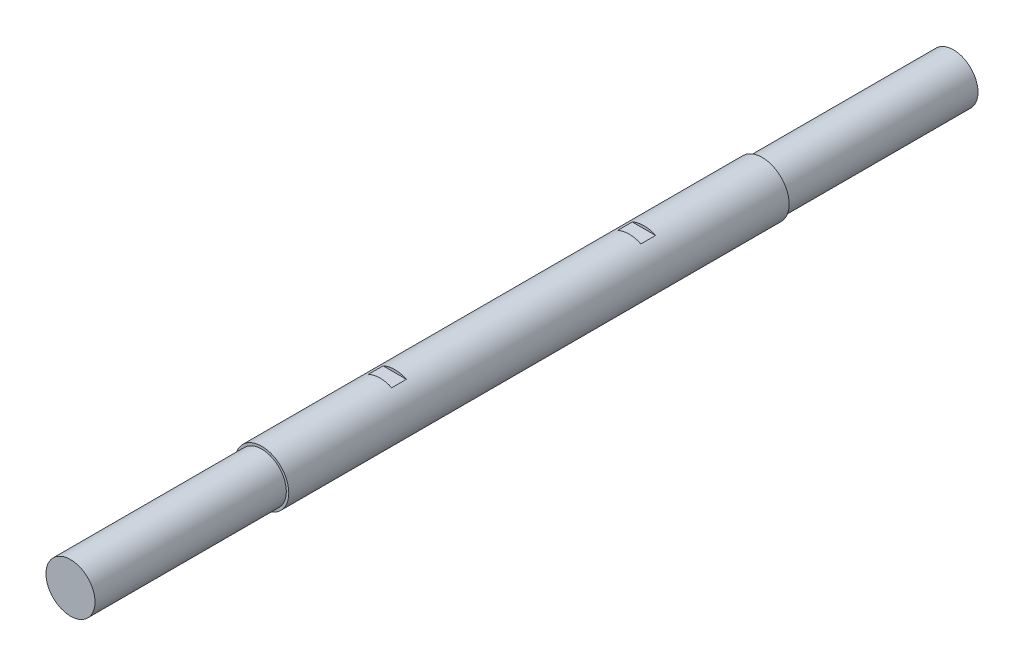
ISO-10303-21;
HEADER;
FILE_DESCRIPTION(('STEP AP214'),'2;1');
FILE_NAME('part.step','',(''),(''),'','','');
FILE_SCHEMA(('AUTOMOTIVE_DESIGN { 1 0 10303 214 1 1 1 1 }'));
ENDSEC;
DATA;
#1=APPLICATION_CONTEXT('core data for automotive mechanical design processes');
#2=APPLICATION_PROTOCOL_DEFINITION('international standard','automotive_design',2000,#1);
#3=PRODUCT_CONTEXT('',#1,'mechanical');
#4=PRODUCT('Part','Part','',(#3));
#5=PRODUCT_RELATED_PRODUCT_CATEGORY('part','',(#4));
#6=PRODUCT_DEFINITION_FORMATION('','',#4);
#7=PRODUCT_DEFINITION_CONTEXT('part definition',#1,'design');
#8=PRODUCT_DEFINITION('design','',#6,#7);
#9=PRODUCT_DEFINITION_SHAPE('','',#8);
#10=(LENGTH_UNIT() NAMED_UNIT(*) SI_UNIT(.MILLI.,.METRE.));
#11=(NAMED_UNIT(*) PLANE_ANGLE_UNIT() SI_UNIT($,.RADIAN.));
#12=(NAMED_UNIT(*) SI_UNIT($,.STERADIAN.) SOLID_ANGLE_UNIT());
#13=UNCERTAINTY_MEASURE_WITH_UNIT(LENGTH_MEASURE(1.E-05),#10,'distance_accuracy_value','');
#14=(GEOMETRIC_REPRESENTATION_CONTEXT(3) GLOBAL_UNCERTAINTY_ASSIGNED_CONTEXT((#13)) GLOBAL_UNIT_ASSIGNED_CONTEXT((#10,
#11,#12)) REPRESENTATION_CONTEXT('',''));
#15=CARTESIAN_POINT('',(0.,0.,0.));
#16=DIRECTION('',(0.,0.,1.));
#17=DIRECTION('',(1.,0.,0.));
#18=AXIS2_PLACEMENT_3D('',#15,#16,#17);
#19=CARTESIAN_POINT('',(0.,0.,-180.));
#20=DIRECTION('',(0.,0.,-1.));
#21=DIRECTION('',(-1.,0.,0.));
#22=AXIS2_PLACEMENT_3D('',#19,#20,#21);
#23=CYLINDRICAL_SURFACE('',#22,11.);
#24=DIRECTION('',(0.,0.,-1.));
#25=VECTOR('',#24,1.);
#26=CARTESIAN_POINT('',(-4.7532725568812,9.91999999999996,-180.));
#27=LINE('',#26,#25);
#28=CARTESIAN_POINT('',(-4.7532725568812,9.91999999999996,-47.8));
#29=VERTEX_POINT('',#28);
#30=CARTESIAN_POINT('',(-4.7532725568812,9.91999999999996,-53.8));
#31=VERTEX_POINT('',#30);
#32=EDGE_CURVE('E78',#29,#31,#27,.T.);
#33=ORIENTED_EDGE('',*,*,#32,.T.);
#34=CARTESIAN_POINT('',(0.,0.,-53.8));
#35=DIRECTION('',(0.,0.,1.));
#36=DIRECTION('',(1.,0.,0.));
#37=AXIS2_PLACEMENT_3D('',#34,#35,#36);
#38=CIRCLE('',#37,11.);
#39=CARTESIAN_POINT('',(4.7532725568812,9.91999999999996,-53.8));
#40=VERTEX_POINT('',#39);
#41=EDGE_CURVE('E11',#31,#40,#38,.F.);
#42=ORIENTED_EDGE('',*,*,#41,.T.);
#43=DIRECTION('',(0.,0.,-1.));
#44=VECTOR('',#43,1.);
#45=CARTESIAN_POINT('',(4.7532725568812,9.91999999999996,-180.));
#46=LINE('',#45,#44);
#47=CARTESIAN_POINT('',(4.7532725568812,9.91999999999996,-47.8));
#48=VERTEX_POINT('',#47);
#49=EDGE_CURVE('E42',#40,#48,#46,.F.);
#50=ORIENTED_EDGE('',*,*,#49,.T.);
#51=CARTESIAN_POINT('',(0.,0.,-47.8));
#52=DIRECTION('',(0.,0.,-1.));
#53=DIRECTION('',(0.,1.,0.));
#54=AXIS2_PLACEMENT_3D('',#51,#52,#53);
#55=CIRCLE('',#54,11.);
#56=EDGE_CURVE('E73',#48,#29,#55,.F.);
#57=ORIENTED_EDGE('',*,*,#56,.T.);
#58=EDGE_LOOP('',(#33,#42,#50,#57));
#59=FACE_BOUND('',#58,.T.);
#60=CARTESIAN_POINT('',(0.,0.,102.));
#61=DIRECTION('',(0.,0.,1.));
#62=DIRECTION('',(1.,0.,0.));
#63=AXIS2_PLACEMENT_3D('',#60,#61,#62);
#64=CIRCLE('',#63,11.);
#65=CARTESIAN_POINT('',(11.,0.,102.));
#66=VERTEX_POINT('',#65);
#67=EDGE_CURVE('E108',#66,#66,#64,.T.);
#68=ORIENTED_EDGE('',*,*,#67,.F.);
#69=EDGE_LOOP('',(#68));
#70=FACE_BOUND('',#69,.T.);
#71=DIRECTION('',(0.,0.,-1.));
#72=VECTOR('',#71,1.);
#73=CARTESIAN_POINT('',(-4.7532725568812,9.91999999999996,-180.));
#74=LINE('',#73,#72);
#75=CARTESIAN_POINT('',(-4.7532725568812,9.91999999999996,47.8));
#76=VERTEX_POINT('',#75);
#77=CARTESIAN_POINT('',(-4.7532725568812,9.91999999999996,53.8));
#78=VERTEX_POINT('',#77);
#79=EDGE_CURVE('E79',#76,#78,#74,.F.);
#80=ORIENTED_EDGE('',*,*,#79,.F.);
#81=CARTESIAN_POINT('',(0.,0.,47.8));
#82=DIRECTION('',(0.,0.,-1.));
#83=DIRECTION('',(0.,1.,0.));
#84=AXIS2_PLACEMENT_3D('',#81,#82,#83);
#85=CIRCLE('',#84,11.);
#86=CARTESIAN_POINT('',(4.7532725568812,9.91999999999996,47.8));
#87=VERTEX_POINT('',#86);
#88=EDGE_CURVE('E94',#87,#76,#85,.F.);
#89=ORIENTED_EDGE('',*,*,#88,.F.);
#90=DIRECTION('',(0.,0.,-1.));
#91=VECTOR('',#90,1.);
#92=CARTESIAN_POINT('',(4.7532725568812,9.91999999999996,-180.));
#93=LINE('',#92,#91);
#94=CARTESIAN_POINT('',(4.7532725568812,9.91999999999996,53.8));
#95=VERTEX_POINT('',#94);
#96=EDGE_CURVE('E96',#95,#87,#93,.T.);
#97=ORIENTED_EDGE('',*,*,#96,.F.);
#98=CARTESIAN_POINT('',(0.,0.,53.8));
#99=DIRECTION('',(0.,0.,1.));
#100=DIRECTION('',(1.,0.,0.));
#101=AXIS2_PLACEMENT_3D('',#98,#99,#100);
#102=CIRCLE('',#101,11.);
#103=EDGE_CURVE('E92',#78,#95,#102,.F.);
#104=ORIENTED_EDGE('',*,*,#103,.F.);
#105=EDGE_LOOP('',(#80,#89,#97,#104));
#106=FACE_BOUND('',#105,.T.);
#107=CARTESIAN_POINT('',(0.,0.,-102.));
#108=DIRECTION('',(0.,0.,1.));
#109=DIRECTION('',(1.,0.,0.));
#110=AXIS2_PLACEMENT_3D('',#107,#108,#109);
#111=CIRCLE('',#110,11.);
#112=CARTESIAN_POINT('',(11.,0.,-102.));
#113=VERTEX_POINT('',#112);
#114=EDGE_CURVE('E117',#113,#113,#111,.T.);
#115=ORIENTED_EDGE('',*,*,#114,.T.);
#116=EDGE_LOOP('',(#115));
#117=FACE_BOUND('',#116,.T.);
#118=ADVANCED_FACE('F34',(#59,#70,#106,#117),#23,.T.);
#119=CARTESIAN_POINT('',(-11.,19.92,53.8));
#120=DIRECTION('',(0.,0.,1.));
#121=DIRECTION('',(1.,0.,0.));
#122=AXIS2_PLACEMENT_3D('',#119,#120,#121);
#123=PLANE('',#122);
#124=ORIENTED_EDGE('',*,*,#103,.T.);
#125=DIRECTION('',(1.,0.,0.));
#126=VECTOR('',#125,1.);
#127=CARTESIAN_POINT('',(-11.,9.91999999999996,53.8));
#128=LINE('',#127,#126);
#129=EDGE_CURVE('E56',#78,#95,#128,.T.);
#130=ORIENTED_EDGE('',*,*,#129,.F.);
#131=EDGE_LOOP('',(#124,#130));
#132=FACE_BOUND('',#131,.T.);
#133=ADVANCED_FACE('F138',(#132),#123,.F.);
#134=CARTESIAN_POINT('',(-11.,19.92,47.8));
#135=DIRECTION('',(0.,0.,-1.));
#136=DIRECTION('',(0.,1.,0.));
#137=AXIS2_PLACEMENT_3D('',#134,#135,#136);
#138=PLANE('',#137);
#139=ORIENTED_EDGE('',*,*,#88,.T.);
#140=DIRECTION('',(1.,0.,0.));
#141=VECTOR('',#140,1.);
#142=CARTESIAN_POINT('',(-11.,9.91999999999996,47.8));
#143=LINE('',#142,#141);
#144=EDGE_CURVE('E98',#76,#87,#143,.T.);
#145=ORIENTED_EDGE('',*,*,#144,.T.);
#146=EDGE_LOOP('',(#139,#145));
#147=FACE_BOUND('',#146,.T.);
#148=ADVANCED_FACE('F142',(#147),#138,.F.);
#149=CARTESIAN_POINT('',(-11.,9.91999999999996,53.8));
#150=DIRECTION('',(0.,-1.,0.));
#151=DIRECTION('',(0.,0.,-1.));
#152=AXIS2_PLACEMENT_3D('',#149,#150,#151);
#153=PLANE('',#152);
#154=ORIENTED_EDGE('',*,*,#79,.T.);
#155=ORIENTED_EDGE('',*,*,#129,.T.);
#156=ORIENTED_EDGE('',*,*,#96,.T.);
#157=ORIENTED_EDGE('',*,*,#144,.F.);
#158=EDGE_LOOP('',(#154,#155,#156,#157));
#159=FACE_BOUND('',#158,.T.);
#160=ADVANCED_FACE('F152',(#159),#153,.F.);
#161=CARTESIAN_POINT('',(0.,0.,180.));
#162=DIRECTION('',(0.,0.,1.));
#163=DIRECTION('',(1.,0.,0.));
#164=AXIS2_PLACEMENT_3D('',#161,#162,#163);
#165=CYLINDRICAL_SURFACE('',#164,10.);
#166=CARTESIAN_POINT('',(0.,0.,102.));
#167=DIRECTION('',(0.,0.,1.));
#168=DIRECTION('',(1.,0.,0.));
#169=AXIS2_PLACEMENT_3D('',#166,#167,#168);
#170=CIRCLE('',#169,10.);
#171=CARTESIAN_POINT('',(10.,0.,102.));
#172=VERTEX_POINT('',#171);
#173=EDGE_CURVE('E105',#172,#172,#170,.T.);
#174=ORIENTED_EDGE('',*,*,#173,.T.);
#175=EDGE_LOOP('',(#174));
#176=FACE_BOUND('',#175,.T.);
#177=CARTESIAN_POINT('',(0.,0.,180.));
#178=DIRECTION('',(0.,0.,1.));
#179=DIRECTION('',(1.,0.,0.));
#180=AXIS2_PLACEMENT_3D('',#177,#178,#179);
#181=CIRCLE('',#180,10.);
#182=CARTESIAN_POINT('',(10.,0.,180.));
#183=VERTEX_POINT('',#182);
#184=EDGE_CURVE('E100',#183,#183,#181,.T.);
#185=ORIENTED_EDGE('',*,*,#184,.F.);
#186=EDGE_LOOP('',(#185));
#187=FACE_BOUND('',#186,.T.);
#188=ADVANCED_FACE('F155',(#176,#187),#165,.T.);
#189=CARTESIAN_POINT('',(0.,11.,102.));
#190=DIRECTION('',(0.,0.,1.));
#191=DIRECTION('',(1.,0.,0.));
#192=AXIS2_PLACEMENT_3D('',#189,#190,#191);
#193=PLANE('',#192);
#194=ORIENTED_EDGE('',*,*,#67,.T.);
#195=EDGE_LOOP('',(#194));
#196=FACE_BOUND('',#195,.T.);
#197=ORIENTED_EDGE('',*,*,#173,.F.);
#198=EDGE_LOOP('',(#197));
#199=FACE_BOUND('',#198,.T.);
#200=ADVANCED_FACE('F149',(#196,#199),#193,.T.);
#201=CARTESIAN_POINT('',(0.,0.,180.));
#202=DIRECTION('',(0.,0.,1.));
#203=DIRECTION('',(1.,0.,0.));
#204=AXIS2_PLACEMENT_3D('',#201,#202,#203);
#205=PLANE('',#204);
#206=ORIENTED_EDGE('',*,*,#184,.T.);
#207=EDGE_LOOP('',(#206));
#208=FACE_BOUND('',#207,.T.);
#209=ADVANCED_FACE('F146',(#208),#205,.T.);
#210=CARTESIAN_POINT('',(-11.,19.92,-53.8));
#211=DIRECTION('',(0.,0.,1.));
#212=DIRECTION('',(1.,0.,0.));
#213=AXIS2_PLACEMENT_3D('',#210,#211,#212);
#214=PLANE('',#213);
#215=DIRECTION('',(1.,0.,0.));
#216=VECTOR('',#215,1.);
#217=CARTESIAN_POINT('',(-11.,9.91999999999996,-53.8));
#218=LINE('',#217,#216);
#219=EDGE_CURVE('E85',#31,#40,#218,.T.);
#220=ORIENTED_EDGE('',*,*,#219,.T.);
#221=ORIENTED_EDGE('',*,*,#41,.F.);
#222=EDGE_LOOP('',(#220,#221));
#223=FACE_BOUND('',#222,.T.);
#224=ADVANCED_FACE('F148',(#223),#214,.T.);
#225=CARTESIAN_POINT('',(-11.,9.91999999999996,-53.8));
#226=DIRECTION('',(0.,1.,0.));
#227=DIRECTION('',(0.,0.,1.));
#228=AXIS2_PLACEMENT_3D('',#225,#226,#227);
#229=PLANE('',#228);
#230=ORIENTED_EDGE('',*,*,#219,.F.);
#231=ORIENTED_EDGE('',*,*,#32,.F.);
#232=DIRECTION('',(1.,0.,0.));
#233=VECTOR('',#232,1.);
#234=CARTESIAN_POINT('',(-11.,9.91999999999996,-47.8));
#235=LINE('',#234,#233);
#236=EDGE_CURVE('E48',#29,#48,#235,.T.);
#237=ORIENTED_EDGE('',*,*,#236,.T.);
#238=ORIENTED_EDGE('',*,*,#49,.F.);
#239=EDGE_LOOP('',(#230,#231,#237,#238));
#240=FACE_BOUND('',#239,.T.);
#241=ADVANCED_FACE('F83',(#240),#229,.T.);
#242=CARTESIAN_POINT('',(-11.,19.92,-47.8));
#243=DIRECTION('',(0.,0.,-1.));
#244=DIRECTION('',(0.,1.,0.));
#245=AXIS2_PLACEMENT_3D('',#242,#243,#244);
#246=PLANE('',#245);
#247=ORIENTED_EDGE('',*,*,#236,.F.);
#248=ORIENTED_EDGE('',*,*,#56,.F.);
#249=EDGE_LOOP('',(#247,#248));
#250=FACE_BOUND('',#249,.T.);
#251=ADVANCED_FACE('F74',(#250),#246,.T.);
#252=CARTESIAN_POINT('',(0.,0.,-102.));
#253=DIRECTION('',(0.,0.,-1.));
#254=DIRECTION('',(1.,0.,0.));
#255=AXIS2_PLACEMENT_3D('',#252,#253,#254);
#256=CYLINDRICAL_SURFACE('',#255,10.);
#257=CARTESIAN_POINT('',(0.,0.,-102.));
#258=DIRECTION('',(0.,0.,1.));
#259=DIRECTION('',(1.,0.,0.));
#260=AXIS2_PLACEMENT_3D('',#257,#258,#259);
#261=CIRCLE('',#260,10.);
#262=CARTESIAN_POINT('',(10.,0.,-102.));
#263=VERTEX_POINT('',#262);
#264=EDGE_CURVE('E114',#263,#263,#261,.T.);
#265=ORIENTED_EDGE('',*,*,#264,.F.);
#266=EDGE_LOOP('',(#265));
#267=FACE_BOUND('',#266,.T.);
#268=CARTESIAN_POINT('',(0.,0.,-180.));
#269=DIRECTION('',(0.,0.,1.));
#270=DIRECTION('',(1.,0.,0.));
#271=AXIS2_PLACEMENT_3D('',#268,#269,#270);
#272=CIRCLE('',#271,10.);
#273=CARTESIAN_POINT('',(10.,0.,-180.));
#274=VERTEX_POINT('',#273);
#275=EDGE_CURVE('E86',#274,#274,#272,.T.);
#276=ORIENTED_EDGE('',*,*,#275,.T.);
#277=EDGE_LOOP('',(#276));
#278=FACE_BOUND('',#277,.T.);
#279=ADVANCED_FACE('F125',(#267,#278),#256,.T.);
#280=CARTESIAN_POINT('',(0.,11.,-102.));
#281=DIRECTION('',(0.,0.,-1.));
#282=DIRECTION('',(1.,0.,0.));
#283=AXIS2_PLACEMENT_3D('',#280,#281,#282);
#284=PLANE('',#283);
#285=ORIENTED_EDGE('',*,*,#114,.F.);
#286=EDGE_LOOP('',(#285));
#287=FACE_BOUND('',#286,.T.);
#288=ORIENTED_EDGE('',*,*,#264,.T.);
#289=EDGE_LOOP('',(#288));
#290=FACE_BOUND('',#289,.T.);
#291=ADVANCED_FACE('F122',(#287,#290),#284,.T.);
#292=CARTESIAN_POINT('',(0.,0.,-180.));
#293=DIRECTION('',(0.,0.,-1.));
#294=DIRECTION('',(-1.,0.,0.));
#295=AXIS2_PLACEMENT_3D('',#292,#293,#294);
#296=PLANE('',#295);
#297=ORIENTED_EDGE('',*,*,#275,.F.);
#298=EDGE_LOOP('',(#297));
#299=FACE_BOUND('',#298,.T.);
#300=ADVANCED_FACE('F36',(#299),#296,.T.);
#301=CLOSED_SHELL('',(#118,#133,#148,#160,#188,#200,#209,#224,#241,#251,#279,#291,#300));
#302=MANIFOLD_SOLID_BREP('B2',#301);
#303=ADVANCED_BREP_SHAPE_REPRESENTATION('',(#18,#302),#14);
#304=SHAPE_DEFINITION_REPRESENTATION(#9,#303);
ENDSEC;
END-ISO-10303-21;
